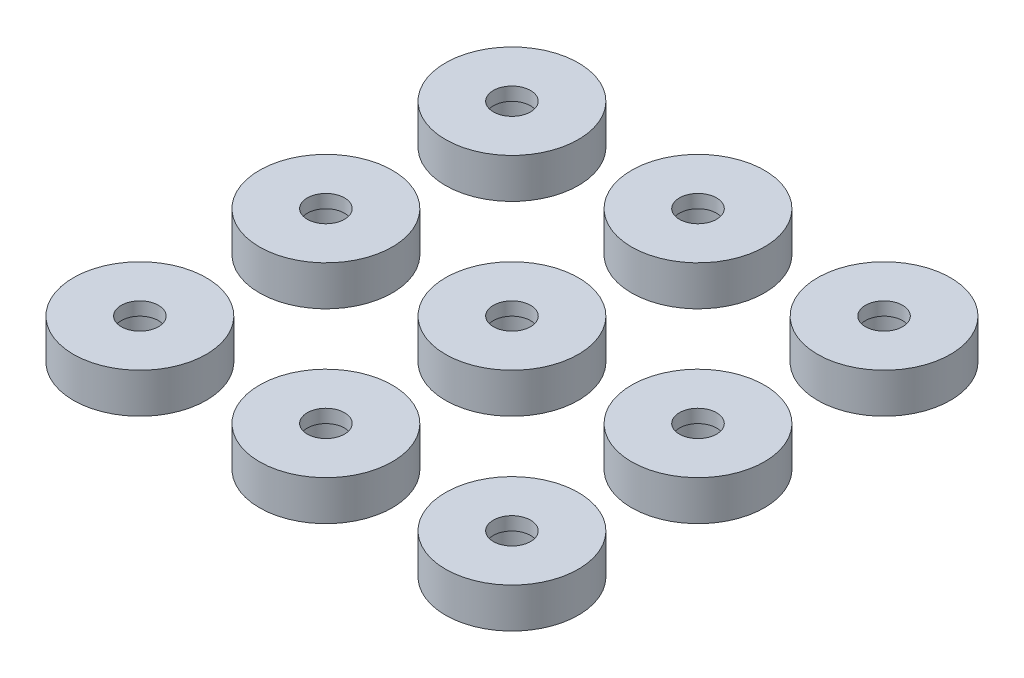
ISO-10303-21;
HEADER;
FILE_DESCRIPTION(('STEP AP214'),'2;1');
FILE_NAME('part.step','',(''),(''),'','','');
FILE_SCHEMA(('AUTOMOTIVE_DESIGN { 1 0 10303 214 1 1 1 1 }'));
ENDSEC;
DATA;
#1=APPLICATION_CONTEXT('core data for automotive mechanical design processes');
#2=APPLICATION_PROTOCOL_DEFINITION('international standard','automotive_design',2000,#1);
#3=PRODUCT_CONTEXT('',#1,'mechanical');
#4=PRODUCT('Part','Part','',(#3));
#5=PRODUCT_RELATED_PRODUCT_CATEGORY('part','',(#4));
#6=PRODUCT_DEFINITION_FORMATION('','',#4);
#7=PRODUCT_DEFINITION_CONTEXT('part definition',#1,'design');
#8=PRODUCT_DEFINITION('design','',#6,#7);
#9=PRODUCT_DEFINITION_SHAPE('','',#8);
#10=(LENGTH_UNIT() NAMED_UNIT(*) SI_UNIT(.MILLI.,.METRE.));
#11=(NAMED_UNIT(*) PLANE_ANGLE_UNIT() SI_UNIT($,.RADIAN.));
#12=(NAMED_UNIT(*) SI_UNIT($,.STERADIAN.) SOLID_ANGLE_UNIT());
#13=UNCERTAINTY_MEASURE_WITH_UNIT(LENGTH_MEASURE(1.E-05),#10,'distance_accuracy_value','');
#14=(GEOMETRIC_REPRESENTATION_CONTEXT(3) GLOBAL_UNCERTAINTY_ASSIGNED_CONTEXT((#13)) GLOBAL_UNIT_ASSIGNED_CONTEXT((#10,
#11,#12)) REPRESENTATION_CONTEXT('',''));
#15=CARTESIAN_POINT('',(0.,0.,0.));
#16=DIRECTION('',(0.,0.,1.));
#17=DIRECTION('',(1.,0.,0.));
#18=AXIS2_PLACEMENT_3D('',#15,#16,#17);
#19=CARTESIAN_POINT('',(14.,1.5,14.));
#20=DIRECTION('',(0.,-1.,0.));
#21=DIRECTION('',(0.,0.,-1.));
#22=AXIS2_PLACEMENT_3D('',#19,#20,#21);
#23=CYLINDRICAL_SURFACE('',#22,2.5);
#24=CARTESIAN_POINT('',(14.,1.5,14.));
#25=DIRECTION('',(0.,1.,0.));
#26=DIRECTION('',(0.,0.,1.));
#27=AXIS2_PLACEMENT_3D('',#24,#25,#26);
#28=CIRCLE('',#27,2.5);
#29=CARTESIAN_POINT('',(14.,1.5,16.5));
#30=VERTEX_POINT('',#29);
#31=EDGE_CURVE('E11',#30,#30,#28,.T.);
#32=ORIENTED_EDGE('',*,*,#31,.F.);
#33=EDGE_LOOP('',(#32));
#34=FACE_BOUND('',#33,.T.);
#35=CARTESIAN_POINT('',(14.,0.,14.));
#36=DIRECTION('',(0.,1.,0.));
#37=DIRECTION('',(0.,0.,1.));
#38=AXIS2_PLACEMENT_3D('',#35,#36,#37);
#39=CIRCLE('',#38,2.5);
#40=CARTESIAN_POINT('',(14.,0.,16.5));
#41=VERTEX_POINT('',#40);
#42=EDGE_CURVE('E53',#41,#41,#39,.T.);
#43=ORIENTED_EDGE('',*,*,#42,.T.);
#44=EDGE_LOOP('',(#43));
#45=FACE_BOUND('',#44,.T.);
#46=ADVANCED_FACE('F46',(#34,#45),#23,.T.);
#47=CARTESIAN_POINT('',(14.,1.5,14.));
#48=DIRECTION('',(0.,1.,0.));
#49=DIRECTION('',(0.,0.,1.));
#50=AXIS2_PLACEMENT_3D('',#47,#48,#49);
#51=PLANE('',#50);
#52=CARTESIAN_POINT('',(14.,1.5,14.));
#53=DIRECTION('',(0.,1.,0.));
#54=DIRECTION('',(0.,0.,1.));
#55=AXIS2_PLACEMENT_3D('',#52,#53,#54);
#56=CIRCLE('',#55,0.7);
#57=CARTESIAN_POINT('',(14.,1.5,14.7));
#58=VERTEX_POINT('',#57);
#59=EDGE_CURVE('E65',#58,#58,#56,.T.);
#60=ORIENTED_EDGE('',*,*,#59,.F.);
#61=EDGE_LOOP('',(#60));
#62=FACE_BOUND('',#61,.T.);
#63=ORIENTED_EDGE('',*,*,#31,.T.);
#64=EDGE_LOOP('',(#63));
#65=FACE_BOUND('',#64,.T.);
#66=ADVANCED_FACE('F89',(#62,#65),#51,.T.);
#67=CARTESIAN_POINT('',(14.,0.,14.));
#68=DIRECTION('',(0.,1.,0.));
#69=DIRECTION('',(0.,0.,1.));
#70=AXIS2_PLACEMENT_3D('',#67,#68,#69);
#71=PLANE('',#70);
#72=CARTESIAN_POINT('',(14.,0.,14.));
#73=DIRECTION('',(0.,1.,0.));
#74=DIRECTION('',(0.,0.,1.));
#75=AXIS2_PLACEMENT_3D('',#72,#73,#74);
#76=CIRCLE('',#75,1.);
#77=CARTESIAN_POINT('',(14.,0.,15.));
#78=VERTEX_POINT('',#77);
#79=EDGE_CURVE('E60',#78,#78,#76,.T.);
#80=ORIENTED_EDGE('',*,*,#79,.T.);
#81=EDGE_LOOP('',(#80));
#82=FACE_BOUND('',#81,.T.);
#83=ORIENTED_EDGE('',*,*,#42,.F.);
#84=EDGE_LOOP('',(#83));
#85=FACE_BOUND('',#84,.T.);
#86=ADVANCED_FACE('F83',(#82,#85),#71,.F.);
#87=CARTESIAN_POINT('',(14.,1.,14.));
#88=DIRECTION('',(0.,-1.,0.));
#89=DIRECTION('',(0.,0.,-1.));
#90=AXIS2_PLACEMENT_3D('',#87,#88,#89);
#91=CYLINDRICAL_SURFACE('',#90,1.);
#92=CARTESIAN_POINT('',(14.,1.,14.));
#93=DIRECTION('',(0.,1.,0.));
#94=DIRECTION('',(0.,0.,1.));
#95=AXIS2_PLACEMENT_3D('',#92,#93,#94);
#96=CIRCLE('',#95,1.);
#97=CARTESIAN_POINT('',(14.,1.,15.));
#98=VERTEX_POINT('',#97);
#99=EDGE_CURVE('E58',#98,#98,#96,.T.);
#100=ORIENTED_EDGE('',*,*,#99,.T.);
#101=EDGE_LOOP('',(#100));
#102=FACE_BOUND('',#101,.T.);
#103=ORIENTED_EDGE('',*,*,#79,.F.);
#104=EDGE_LOOP('',(#103));
#105=FACE_BOUND('',#104,.T.);
#106=ADVANCED_FACE('F77',(#102,#105),#91,.F.);
#107=CARTESIAN_POINT('',(14.,1.,14.));
#108=DIRECTION('',(0.,1.,0.));
#109=DIRECTION('',(0.,0.,1.));
#110=AXIS2_PLACEMENT_3D('',#107,#108,#109);
#111=PLANE('',#110);
#112=CARTESIAN_POINT('',(14.,1.,14.));
#113=DIRECTION('',(0.,1.,0.));
#114=DIRECTION('',(0.,0.,1.));
#115=AXIS2_PLACEMENT_3D('',#112,#113,#114);
#116=CIRCLE('',#115,0.7);
#117=CARTESIAN_POINT('',(14.,1.,14.7));
#118=VERTEX_POINT('',#117);
#119=EDGE_CURVE('E49',#118,#118,#116,.F.);
#120=ORIENTED_EDGE('',*,*,#119,.F.);
#121=EDGE_LOOP('',(#120));
#122=FACE_BOUND('',#121,.T.);
#123=ORIENTED_EDGE('',*,*,#99,.F.);
#124=EDGE_LOOP('',(#123));
#125=FACE_BOUND('',#124,.T.);
#126=ADVANCED_FACE('F74',(#122,#125),#111,.F.);
#127=CARTESIAN_POINT('',(14.,1.5,14.));
#128=DIRECTION('',(0.,-1.,0.));
#129=DIRECTION('',(0.,0.,-1.));
#130=AXIS2_PLACEMENT_3D('',#127,#128,#129);
#131=CYLINDRICAL_SURFACE('',#130,0.7);
#132=ORIENTED_EDGE('',*,*,#59,.T.);
#133=EDGE_LOOP('',(#132));
#134=FACE_BOUND('',#133,.T.);
#135=ORIENTED_EDGE('',*,*,#119,.T.);
#136=EDGE_LOOP('',(#135));
#137=FACE_BOUND('',#136,.T.);
#138=ADVANCED_FACE('F72',(#134,#137),#131,.F.);
#139=CLOSED_SHELL('',(#46,#66,#86,#106,#126,#138));
#140=MANIFOLD_SOLID_BREP('B2',#139);
#141=CARTESIAN_POINT('',(7.,1.5,14.));
#142=DIRECTION('',(0.,-1.,0.));
#143=DIRECTION('',(0.,0.,-1.));
#144=AXIS2_PLACEMENT_3D('',#141,#142,#143);
#145=CYLINDRICAL_SURFACE('',#144,2.5);
#146=CARTESIAN_POINT('',(7.,1.5,14.));
#147=DIRECTION('',(0.,1.,0.));
#148=DIRECTION('',(0.,0.,1.));
#149=AXIS2_PLACEMENT_3D('',#146,#147,#148);
#150=CIRCLE('',#149,2.5);
#151=CARTESIAN_POINT('',(7.,1.5,16.5));
#152=VERTEX_POINT('',#151);
#153=EDGE_CURVE('E45',#152,#152,#150,.T.);
#154=ORIENTED_EDGE('',*,*,#153,.F.);
#155=EDGE_LOOP('',(#154));
#156=FACE_BOUND('',#155,.T.);
#157=CARTESIAN_POINT('',(7.,0.,14.));
#158=DIRECTION('',(0.,1.,0.));
#159=DIRECTION('',(0.,0.,1.));
#160=AXIS2_PLACEMENT_3D('',#157,#158,#159);
#161=CIRCLE('',#160,2.5);
#162=CARTESIAN_POINT('',(7.,0.,16.5));
#163=VERTEX_POINT('',#162);
#164=EDGE_CURVE('E153',#163,#163,#161,.T.);
#165=ORIENTED_EDGE('',*,*,#164,.T.);
#166=EDGE_LOOP('',(#165));
#167=FACE_BOUND('',#166,.T.);
#168=ADVANCED_FACE('F146',(#156,#167),#145,.T.);
#169=CARTESIAN_POINT('',(7.,1.5,14.));
#170=DIRECTION('',(0.,1.,0.));
#171=DIRECTION('',(0.,0.,1.));
#172=AXIS2_PLACEMENT_3D('',#169,#170,#171);
#173=PLANE('',#172);
#174=CARTESIAN_POINT('',(7.,1.5,14.));
#175=DIRECTION('',(0.,1.,0.));
#176=DIRECTION('',(0.,0.,1.));
#177=AXIS2_PLACEMENT_3D('',#174,#175,#176);
#178=CIRCLE('',#177,0.7);
#179=CARTESIAN_POINT('',(7.,1.5,14.7));
#180=VERTEX_POINT('',#179);
#181=EDGE_CURVE('E165',#180,#180,#178,.T.);
#182=ORIENTED_EDGE('',*,*,#181,.F.);
#183=EDGE_LOOP('',(#182));
#184=FACE_BOUND('',#183,.T.);
#185=ORIENTED_EDGE('',*,*,#153,.T.);
#186=EDGE_LOOP('',(#185));
#187=FACE_BOUND('',#186,.T.);
#188=ADVANCED_FACE('F189',(#184,#187),#173,.T.);
#189=CARTESIAN_POINT('',(7.,0.,14.));
#190=DIRECTION('',(0.,1.,0.));
#191=DIRECTION('',(0.,0.,1.));
#192=AXIS2_PLACEMENT_3D('',#189,#190,#191);
#193=PLANE('',#192);
#194=CARTESIAN_POINT('',(7.,0.,14.));
#195=DIRECTION('',(0.,1.,0.));
#196=DIRECTION('',(0.,0.,1.));
#197=AXIS2_PLACEMENT_3D('',#194,#195,#196);
#198=CIRCLE('',#197,1.);
#199=CARTESIAN_POINT('',(7.,0.,15.));
#200=VERTEX_POINT('',#199);
#201=EDGE_CURVE('E160',#200,#200,#198,.T.);
#202=ORIENTED_EDGE('',*,*,#201,.T.);
#203=EDGE_LOOP('',(#202));
#204=FACE_BOUND('',#203,.T.);
#205=ORIENTED_EDGE('',*,*,#164,.F.);
#206=EDGE_LOOP('',(#205));
#207=FACE_BOUND('',#206,.T.);
#208=ADVANCED_FACE('F183',(#204,#207),#193,.F.);
#209=CARTESIAN_POINT('',(7.,1.,14.));
#210=DIRECTION('',(0.,-1.,0.));
#211=DIRECTION('',(0.,0.,-1.));
#212=AXIS2_PLACEMENT_3D('',#209,#210,#211);
#213=CYLINDRICAL_SURFACE('',#212,1.);
#214=CARTESIAN_POINT('',(7.,1.,14.));
#215=DIRECTION('',(0.,1.,0.));
#216=DIRECTION('',(0.,0.,1.));
#217=AXIS2_PLACEMENT_3D('',#214,#215,#216);
#218=CIRCLE('',#217,1.);
#219=CARTESIAN_POINT('',(7.,1.,15.));
#220=VERTEX_POINT('',#219);
#221=EDGE_CURVE('E158',#220,#220,#218,.T.);
#222=ORIENTED_EDGE('',*,*,#221,.T.);
#223=EDGE_LOOP('',(#222));
#224=FACE_BOUND('',#223,.T.);
#225=ORIENTED_EDGE('',*,*,#201,.F.);
#226=EDGE_LOOP('',(#225));
#227=FACE_BOUND('',#226,.T.);
#228=ADVANCED_FACE('F177',(#224,#227),#213,.F.);
#229=CARTESIAN_POINT('',(7.,1.,14.));
#230=DIRECTION('',(0.,1.,0.));
#231=DIRECTION('',(0.,0.,1.));
#232=AXIS2_PLACEMENT_3D('',#229,#230,#231);
#233=PLANE('',#232);
#234=CARTESIAN_POINT('',(7.,1.,14.));
#235=DIRECTION('',(0.,1.,0.));
#236=DIRECTION('',(0.,0.,1.));
#237=AXIS2_PLACEMENT_3D('',#234,#235,#236);
#238=CIRCLE('',#237,0.7);
#239=CARTESIAN_POINT('',(7.,1.,14.7));
#240=VERTEX_POINT('',#239);
#241=EDGE_CURVE('E149',#240,#240,#238,.F.);
#242=ORIENTED_EDGE('',*,*,#241,.F.);
#243=EDGE_LOOP('',(#242));
#244=FACE_BOUND('',#243,.T.);
#245=ORIENTED_EDGE('',*,*,#221,.F.);
#246=EDGE_LOOP('',(#245));
#247=FACE_BOUND('',#246,.T.);
#248=ADVANCED_FACE('F174',(#244,#247),#233,.F.);
#249=CARTESIAN_POINT('',(7.,1.5,14.));
#250=DIRECTION('',(0.,-1.,0.));
#251=DIRECTION('',(0.,0.,-1.));
#252=AXIS2_PLACEMENT_3D('',#249,#250,#251);
#253=CYLINDRICAL_SURFACE('',#252,0.7);
#254=ORIENTED_EDGE('',*,*,#181,.T.);
#255=EDGE_LOOP('',(#254));
#256=FACE_BOUND('',#255,.T.);
#257=ORIENTED_EDGE('',*,*,#241,.T.);
#258=EDGE_LOOP('',(#257));
#259=FACE_BOUND('',#258,.T.);
#260=ADVANCED_FACE('F172',(#256,#259),#253,.F.);
#261=CLOSED_SHELL('',(#168,#188,#208,#228,#248,#260));
#262=MANIFOLD_SOLID_BREP('B6',#261);
#263=CARTESIAN_POINT('',(14.,1.5,7.));
#264=DIRECTION('',(0.,-1.,0.));
#265=DIRECTION('',(0.,0.,-1.));
#266=AXIS2_PLACEMENT_3D('',#263,#264,#265);
#267=CYLINDRICAL_SURFACE('',#266,2.5);
#268=CARTESIAN_POINT('',(14.,1.5,7.));
#269=DIRECTION('',(0.,1.,0.));
#270=DIRECTION('',(0.,0.,1.));
#271=AXIS2_PLACEMENT_3D('',#268,#269,#270);
#272=CIRCLE('',#271,2.5);
#273=CARTESIAN_POINT('',(14.,1.5,9.5));
#274=VERTEX_POINT('',#273);
#275=EDGE_CURVE('E145',#274,#274,#272,.T.);
#276=ORIENTED_EDGE('',*,*,#275,.F.);
#277=EDGE_LOOP('',(#276));
#278=FACE_BOUND('',#277,.T.);
#279=CARTESIAN_POINT('',(14.,0.,7.));
#280=DIRECTION('',(0.,1.,0.));
#281=DIRECTION('',(0.,0.,1.));
#282=AXIS2_PLACEMENT_3D('',#279,#280,#281);
#283=CIRCLE('',#282,2.5);
#284=CARTESIAN_POINT('',(14.,0.,9.5));
#285=VERTEX_POINT('',#284);
#286=EDGE_CURVE('E253',#285,#285,#283,.T.);
#287=ORIENTED_EDGE('',*,*,#286,.T.);
#288=EDGE_LOOP('',(#287));
#289=FACE_BOUND('',#288,.T.);
#290=ADVANCED_FACE('F246',(#278,#289),#267,.T.);
#291=CARTESIAN_POINT('',(14.,1.5,7.));
#292=DIRECTION('',(0.,1.,0.));
#293=DIRECTION('',(0.,0.,1.));
#294=AXIS2_PLACEMENT_3D('',#291,#292,#293);
#295=PLANE('',#294);
#296=CARTESIAN_POINT('',(14.,1.5,7.));
#297=DIRECTION('',(0.,1.,0.));
#298=DIRECTION('',(0.,0.,1.));
#299=AXIS2_PLACEMENT_3D('',#296,#297,#298);
#300=CIRCLE('',#299,0.7);
#301=CARTESIAN_POINT('',(14.,1.5,7.7));
#302=VERTEX_POINT('',#301);
#303=EDGE_CURVE('E265',#302,#302,#300,.T.);
#304=ORIENTED_EDGE('',*,*,#303,.F.);
#305=EDGE_LOOP('',(#304));
#306=FACE_BOUND('',#305,.T.);
#307=ORIENTED_EDGE('',*,*,#275,.T.);
#308=EDGE_LOOP('',(#307));
#309=FACE_BOUND('',#308,.T.);
#310=ADVANCED_FACE('F289',(#306,#309),#295,.T.);
#311=CARTESIAN_POINT('',(14.,0.,7.));
#312=DIRECTION('',(0.,1.,0.));
#313=DIRECTION('',(0.,0.,1.));
#314=AXIS2_PLACEMENT_3D('',#311,#312,#313);
#315=PLANE('',#314);
#316=CARTESIAN_POINT('',(14.,0.,7.));
#317=DIRECTION('',(0.,1.,0.));
#318=DIRECTION('',(0.,0.,1.));
#319=AXIS2_PLACEMENT_3D('',#316,#317,#318);
#320=CIRCLE('',#319,1.);
#321=CARTESIAN_POINT('',(14.,0.,8.));
#322=VERTEX_POINT('',#321);
#323=EDGE_CURVE('E260',#322,#322,#320,.T.);
#324=ORIENTED_EDGE('',*,*,#323,.T.);
#325=EDGE_LOOP('',(#324));
#326=FACE_BOUND('',#325,.T.);
#327=ORIENTED_EDGE('',*,*,#286,.F.);
#328=EDGE_LOOP('',(#327));
#329=FACE_BOUND('',#328,.T.);
#330=ADVANCED_FACE('F283',(#326,#329),#315,.F.);
#331=CARTESIAN_POINT('',(14.,1.,7.));
#332=DIRECTION('',(0.,-1.,0.));
#333=DIRECTION('',(0.,0.,-1.));
#334=AXIS2_PLACEMENT_3D('',#331,#332,#333);
#335=CYLINDRICAL_SURFACE('',#334,1.);
#336=CARTESIAN_POINT('',(14.,1.,7.));
#337=DIRECTION('',(0.,1.,0.));
#338=DIRECTION('',(0.,0.,1.));
#339=AXIS2_PLACEMENT_3D('',#336,#337,#338);
#340=CIRCLE('',#339,1.);
#341=CARTESIAN_POINT('',(14.,1.,8.));
#342=VERTEX_POINT('',#341);
#343=EDGE_CURVE('E258',#342,#342,#340,.T.);
#344=ORIENTED_EDGE('',*,*,#343,.T.);
#345=EDGE_LOOP('',(#344));
#346=FACE_BOUND('',#345,.T.);
#347=ORIENTED_EDGE('',*,*,#323,.F.);
#348=EDGE_LOOP('',(#347));
#349=FACE_BOUND('',#348,.T.);
#350=ADVANCED_FACE('F277',(#346,#349),#335,.F.);
#351=CARTESIAN_POINT('',(14.,1.,7.));
#352=DIRECTION('',(0.,1.,0.));
#353=DIRECTION('',(0.,0.,1.));
#354=AXIS2_PLACEMENT_3D('',#351,#352,#353);
#355=PLANE('',#354);
#356=CARTESIAN_POINT('',(14.,1.,7.));
#357=DIRECTION('',(0.,1.,0.));
#358=DIRECTION('',(0.,0.,1.));
#359=AXIS2_PLACEMENT_3D('',#356,#357,#358);
#360=CIRCLE('',#359,0.7);
#361=CARTESIAN_POINT('',(14.,1.,7.7));
#362=VERTEX_POINT('',#361);
#363=EDGE_CURVE('E249',#362,#362,#360,.F.);
#364=ORIENTED_EDGE('',*,*,#363,.F.);
#365=EDGE_LOOP('',(#364));
#366=FACE_BOUND('',#365,.T.);
#367=ORIENTED_EDGE('',*,*,#343,.F.);
#368=EDGE_LOOP('',(#367));
#369=FACE_BOUND('',#368,.T.);
#370=ADVANCED_FACE('F274',(#366,#369),#355,.F.);
#371=CARTESIAN_POINT('',(14.,1.5,7.));
#372=DIRECTION('',(0.,-1.,0.));
#373=DIRECTION('',(0.,0.,-1.));
#374=AXIS2_PLACEMENT_3D('',#371,#372,#373);
#375=CYLINDRICAL_SURFACE('',#374,0.7);
#376=ORIENTED_EDGE('',*,*,#303,.T.);
#377=EDGE_LOOP('',(#376));
#378=FACE_BOUND('',#377,.T.);
#379=ORIENTED_EDGE('',*,*,#363,.T.);
#380=EDGE_LOOP('',(#379));
#381=FACE_BOUND('',#380,.T.);
#382=ADVANCED_FACE('F272',(#378,#381),#375,.F.);
#383=CLOSED_SHELL('',(#290,#310,#330,#350,#370,#382));
#384=MANIFOLD_SOLID_BREP('B40',#383);
#385=CARTESIAN_POINT('',(7.,1.5,7.));
#386=DIRECTION('',(0.,-1.,0.));
#387=DIRECTION('',(0.,0.,-1.));
#388=AXIS2_PLACEMENT_3D('',#385,#386,#387);
#389=CYLINDRICAL_SURFACE('',#388,2.5);
#390=CARTESIAN_POINT('',(7.,1.5,7.));
#391=DIRECTION('',(0.,1.,0.));
#392=DIRECTION('',(0.,0.,1.));
#393=AXIS2_PLACEMENT_3D('',#390,#391,#392);
#394=CIRCLE('',#393,2.5);
#395=CARTESIAN_POINT('',(7.,1.5,9.5));
#396=VERTEX_POINT('',#395);
#397=EDGE_CURVE('E245',#396,#396,#394,.T.);
#398=ORIENTED_EDGE('',*,*,#397,.F.);
#399=EDGE_LOOP('',(#398));
#400=FACE_BOUND('',#399,.T.);
#401=CARTESIAN_POINT('',(7.,0.,7.));
#402=DIRECTION('',(0.,1.,0.));
#403=DIRECTION('',(0.,0.,1.));
#404=AXIS2_PLACEMENT_3D('',#401,#402,#403);
#405=CIRCLE('',#404,2.5);
#406=CARTESIAN_POINT('',(7.,0.,9.5));
#407=VERTEX_POINT('',#406);
#408=EDGE_CURVE('E353',#407,#407,#405,.T.);
#409=ORIENTED_EDGE('',*,*,#408,.T.);
#410=EDGE_LOOP('',(#409));
#411=FACE_BOUND('',#410,.T.);
#412=ADVANCED_FACE('F346',(#400,#411),#389,.T.);
#413=CARTESIAN_POINT('',(7.,1.5,7.));
#414=DIRECTION('',(0.,1.,0.));
#415=DIRECTION('',(0.,0.,1.));
#416=AXIS2_PLACEMENT_3D('',#413,#414,#415);
#417=PLANE('',#416);
#418=CARTESIAN_POINT('',(7.,1.5,7.));
#419=DIRECTION('',(0.,1.,0.));
#420=DIRECTION('',(0.,0.,1.));
#421=AXIS2_PLACEMENT_3D('',#418,#419,#420);
#422=CIRCLE('',#421,0.7);
#423=CARTESIAN_POINT('',(7.,1.5,7.7));
#424=VERTEX_POINT('',#423);
#425=EDGE_CURVE('E365',#424,#424,#422,.T.);
#426=ORIENTED_EDGE('',*,*,#425,.F.);
#427=EDGE_LOOP('',(#426));
#428=FACE_BOUND('',#427,.T.);
#429=ORIENTED_EDGE('',*,*,#397,.T.);
#430=EDGE_LOOP('',(#429));
#431=FACE_BOUND('',#430,.T.);
#432=ADVANCED_FACE('F389',(#428,#431),#417,.T.);
#433=CARTESIAN_POINT('',(7.,0.,7.));
#434=DIRECTION('',(0.,1.,0.));
#435=DIRECTION('',(0.,0.,1.));
#436=AXIS2_PLACEMENT_3D('',#433,#434,#435);
#437=PLANE('',#436);
#438=CARTESIAN_POINT('',(7.,0.,7.));
#439=DIRECTION('',(0.,1.,0.));
#440=DIRECTION('',(0.,0.,1.));
#441=AXIS2_PLACEMENT_3D('',#438,#439,#440);
#442=CIRCLE('',#441,1.);
#443=CARTESIAN_POINT('',(7.,0.,8.));
#444=VERTEX_POINT('',#443);
#445=EDGE_CURVE('E360',#444,#444,#442,.T.);
#446=ORIENTED_EDGE('',*,*,#445,.T.);
#447=EDGE_LOOP('',(#446));
#448=FACE_BOUND('',#447,.T.);
#449=ORIENTED_EDGE('',*,*,#408,.F.);
#450=EDGE_LOOP('',(#449));
#451=FACE_BOUND('',#450,.T.);
#452=ADVANCED_FACE('F383',(#448,#451),#437,.F.);
#453=CARTESIAN_POINT('',(7.,1.,7.));
#454=DIRECTION('',(0.,-1.,0.));
#455=DIRECTION('',(0.,0.,-1.));
#456=AXIS2_PLACEMENT_3D('',#453,#454,#455);
#457=CYLINDRICAL_SURFACE('',#456,1.);
#458=CARTESIAN_POINT('',(7.,1.,7.));
#459=DIRECTION('',(0.,1.,0.));
#460=DIRECTION('',(0.,0.,1.));
#461=AXIS2_PLACEMENT_3D('',#458,#459,#460);
#462=CIRCLE('',#461,1.);
#463=CARTESIAN_POINT('',(7.,1.,8.));
#464=VERTEX_POINT('',#463);
#465=EDGE_CURVE('E358',#464,#464,#462,.T.);
#466=ORIENTED_EDGE('',*,*,#465,.T.);
#467=EDGE_LOOP('',(#466));
#468=FACE_BOUND('',#467,.T.);
#469=ORIENTED_EDGE('',*,*,#445,.F.);
#470=EDGE_LOOP('',(#469));
#471=FACE_BOUND('',#470,.T.);
#472=ADVANCED_FACE('F377',(#468,#471),#457,.F.);
#473=CARTESIAN_POINT('',(7.,1.,7.));
#474=DIRECTION('',(0.,1.,0.));
#475=DIRECTION('',(0.,0.,1.));
#476=AXIS2_PLACEMENT_3D('',#473,#474,#475);
#477=PLANE('',#476);
#478=CARTESIAN_POINT('',(7.,1.,7.));
#479=DIRECTION('',(0.,1.,0.));
#480=DIRECTION('',(0.,0.,1.));
#481=AXIS2_PLACEMENT_3D('',#478,#479,#480);
#482=CIRCLE('',#481,0.7);
#483=CARTESIAN_POINT('',(7.,1.,7.7));
#484=VERTEX_POINT('',#483);
#485=EDGE_CURVE('E349',#484,#484,#482,.F.);
#486=ORIENTED_EDGE('',*,*,#485,.F.);
#487=EDGE_LOOP('',(#486));
#488=FACE_BOUND('',#487,.T.);
#489=ORIENTED_EDGE('',*,*,#465,.F.);
#490=EDGE_LOOP('',(#489));
#491=FACE_BOUND('',#490,.T.);
#492=ADVANCED_FACE('F374',(#488,#491),#477,.F.);
#493=CARTESIAN_POINT('',(7.,1.5,7.));
#494=DIRECTION('',(0.,-1.,0.));
#495=DIRECTION('',(0.,0.,-1.));
#496=AXIS2_PLACEMENT_3D('',#493,#494,#495);
#497=CYLINDRICAL_SURFACE('',#496,0.7);
#498=ORIENTED_EDGE('',*,*,#425,.T.);
#499=EDGE_LOOP('',(#498));
#500=FACE_BOUND('',#499,.T.);
#501=ORIENTED_EDGE('',*,*,#485,.T.);
#502=EDGE_LOOP('',(#501));
#503=FACE_BOUND('',#502,.T.);
#504=ADVANCED_FACE('F372',(#500,#503),#497,.F.);
#505=CLOSED_SHELL('',(#412,#432,#452,#472,#492,#504));
#506=MANIFOLD_SOLID_BREP('B140',#505);
#507=CARTESIAN_POINT('',(14.,1.5,0.));
#508=DIRECTION('',(0.,-1.,0.));
#509=DIRECTION('',(0.,0.,-1.));
#510=AXIS2_PLACEMENT_3D('',#507,#508,#509);
#511=CYLINDRICAL_SURFACE('',#510,2.5);
#512=CARTESIAN_POINT('',(14.,1.5,0.));
#513=DIRECTION('',(0.,1.,0.));
#514=DIRECTION('',(0.,0.,1.));
#515=AXIS2_PLACEMENT_3D('',#512,#513,#514);
#516=CIRCLE('',#515,2.5);
#517=CARTESIAN_POINT('',(14.,1.5,2.5));
#518=VERTEX_POINT('',#517);
#519=EDGE_CURVE('E345',#518,#518,#516,.T.);
#520=ORIENTED_EDGE('',*,*,#519,.F.);
#521=EDGE_LOOP('',(#520));
#522=FACE_BOUND('',#521,.T.);
#523=CARTESIAN_POINT('',(14.,0.,0.));
#524=DIRECTION('',(0.,1.,0.));
#525=DIRECTION('',(0.,0.,1.));
#526=AXIS2_PLACEMENT_3D('',#523,#524,#525);
#527=CIRCLE('',#526,2.5);
#528=CARTESIAN_POINT('',(14.,0.,2.5));
#529=VERTEX_POINT('',#528);
#530=EDGE_CURVE('E453',#529,#529,#527,.T.);
#531=ORIENTED_EDGE('',*,*,#530,.T.);
#532=EDGE_LOOP('',(#531));
#533=FACE_BOUND('',#532,.T.);
#534=ADVANCED_FACE('F446',(#522,#533),#511,.T.);
#535=CARTESIAN_POINT('',(14.,1.5,0.));
#536=DIRECTION('',(0.,1.,0.));
#537=DIRECTION('',(0.,0.,1.));
#538=AXIS2_PLACEMENT_3D('',#535,#536,#537);
#539=PLANE('',#538);
#540=CARTESIAN_POINT('',(14.,1.5,0.));
#541=DIRECTION('',(0.,1.,0.));
#542=DIRECTION('',(0.,0.,1.));
#543=AXIS2_PLACEMENT_3D('',#540,#541,#542);
#544=CIRCLE('',#543,0.7);
#545=CARTESIAN_POINT('',(14.,1.5,0.7));
#546=VERTEX_POINT('',#545);
#547=EDGE_CURVE('E465',#546,#546,#544,.T.);
#548=ORIENTED_EDGE('',*,*,#547,.F.);
#549=EDGE_LOOP('',(#548));
#550=FACE_BOUND('',#549,.T.);
#551=ORIENTED_EDGE('',*,*,#519,.T.);
#552=EDGE_LOOP('',(#551));
#553=FACE_BOUND('',#552,.T.);
#554=ADVANCED_FACE('F489',(#550,#553),#539,.T.);
#555=CARTESIAN_POINT('',(14.,0.,0.));
#556=DIRECTION('',(0.,1.,0.));
#557=DIRECTION('',(0.,0.,1.));
#558=AXIS2_PLACEMENT_3D('',#555,#556,#557);
#559=PLANE('',#558);
#560=CARTESIAN_POINT('',(14.,0.,0.));
#561=DIRECTION('',(0.,1.,0.));
#562=DIRECTION('',(0.,0.,1.));
#563=AXIS2_PLACEMENT_3D('',#560,#561,#562);
#564=CIRCLE('',#563,1.);
#565=CARTESIAN_POINT('',(14.,0.,1.));
#566=VERTEX_POINT('',#565);
#567=EDGE_CURVE('E460',#566,#566,#564,.T.);
#568=ORIENTED_EDGE('',*,*,#567,.T.);
#569=EDGE_LOOP('',(#568));
#570=FACE_BOUND('',#569,.T.);
#571=ORIENTED_EDGE('',*,*,#530,.F.);
#572=EDGE_LOOP('',(#571));
#573=FACE_BOUND('',#572,.T.);
#574=ADVANCED_FACE('F483',(#570,#573),#559,.F.);
#575=CARTESIAN_POINT('',(14.,1.,0.));
#576=DIRECTION('',(0.,-1.,0.));
#577=DIRECTION('',(0.,0.,-1.));
#578=AXIS2_PLACEMENT_3D('',#575,#576,#577);
#579=CYLINDRICAL_SURFACE('',#578,1.);
#580=CARTESIAN_POINT('',(14.,1.,0.));
#581=DIRECTION('',(0.,1.,0.));
#582=DIRECTION('',(0.,0.,1.));
#583=AXIS2_PLACEMENT_3D('',#580,#581,#582);
#584=CIRCLE('',#583,1.);
#585=CARTESIAN_POINT('',(14.,1.,1.));
#586=VERTEX_POINT('',#585);
#587=EDGE_CURVE('E458',#586,#586,#584,.T.);
#588=ORIENTED_EDGE('',*,*,#587,.T.);
#589=EDGE_LOOP('',(#588));
#590=FACE_BOUND('',#589,.T.);
#591=ORIENTED_EDGE('',*,*,#567,.F.);
#592=EDGE_LOOP('',(#591));
#593=FACE_BOUND('',#592,.T.);
#594=ADVANCED_FACE('F477',(#590,#593),#579,.F.);
#595=CARTESIAN_POINT('',(14.,1.,0.));
#596=DIRECTION('',(0.,1.,0.));
#597=DIRECTION('',(0.,0.,1.));
#598=AXIS2_PLACEMENT_3D('',#595,#596,#597);
#599=PLANE('',#598);
#600=CARTESIAN_POINT('',(14.,1.,0.));
#601=DIRECTION('',(0.,1.,0.));
#602=DIRECTION('',(0.,0.,1.));
#603=AXIS2_PLACEMENT_3D('',#600,#601,#602);
#604=CIRCLE('',#603,0.7);
#605=CARTESIAN_POINT('',(14.,1.,0.7));
#606=VERTEX_POINT('',#605);
#607=EDGE_CURVE('E449',#606,#606,#604,.F.);
#608=ORIENTED_EDGE('',*,*,#607,.F.);
#609=EDGE_LOOP('',(#608));
#610=FACE_BOUND('',#609,.T.);
#611=ORIENTED_EDGE('',*,*,#587,.F.);
#612=EDGE_LOOP('',(#611));
#613=FACE_BOUND('',#612,.T.);
#614=ADVANCED_FACE('F474',(#610,#613),#599,.F.);
#615=CARTESIAN_POINT('',(14.,1.5,0.));
#616=DIRECTION('',(0.,-1.,0.));
#617=DIRECTION('',(0.,0.,-1.));
#618=AXIS2_PLACEMENT_3D('',#615,#616,#617);
#619=CYLINDRICAL_SURFACE('',#618,0.7);
#620=ORIENTED_EDGE('',*,*,#547,.T.);
#621=EDGE_LOOP('',(#620));
#622=FACE_BOUND('',#621,.T.);
#623=ORIENTED_EDGE('',*,*,#607,.T.);
#624=EDGE_LOOP('',(#623));
#625=FACE_BOUND('',#624,.T.);
#626=ADVANCED_FACE('F472',(#622,#625),#619,.F.);
#627=CLOSED_SHELL('',(#534,#554,#574,#594,#614,#626));
#628=MANIFOLD_SOLID_BREP('B240',#627);
#629=CARTESIAN_POINT('',(7.,1.5,0.));
#630=DIRECTION('',(0.,-1.,0.));
#631=DIRECTION('',(0.,0.,-1.));
#632=AXIS2_PLACEMENT_3D('',#629,#630,#631);
#633=CYLINDRICAL_SURFACE('',#632,2.5);
#634=CARTESIAN_POINT('',(7.,1.5,0.));
#635=DIRECTION('',(0.,1.,0.));
#636=DIRECTION('',(0.,0.,1.));
#637=AXIS2_PLACEMENT_3D('',#634,#635,#636);
#638=CIRCLE('',#637,2.5);
#639=CARTESIAN_POINT('',(7.,1.5,2.5));
#640=VERTEX_POINT('',#639);
#641=EDGE_CURVE('E445',#640,#640,#638,.T.);
#642=ORIENTED_EDGE('',*,*,#641,.F.);
#643=EDGE_LOOP('',(#642));
#644=FACE_BOUND('',#643,.T.);
#645=CARTESIAN_POINT('',(7.,0.,0.));
#646=DIRECTION('',(0.,1.,0.));
#647=DIRECTION('',(0.,0.,1.));
#648=AXIS2_PLACEMENT_3D('',#645,#646,#647);
#649=CIRCLE('',#648,2.5);
#650=CARTESIAN_POINT('',(7.,0.,2.5));
#651=VERTEX_POINT('',#650);
#652=EDGE_CURVE('E554',#651,#651,#649,.T.);
#653=ORIENTED_EDGE('',*,*,#652,.T.);
#654=EDGE_LOOP('',(#653));
#655=FACE_BOUND('',#654,.T.);
#656=ADVANCED_FACE('F546',(#644,#655),#633,.T.);
#657=CARTESIAN_POINT('',(7.,1.5,0.));
#658=DIRECTION('',(0.,1.,0.));
#659=DIRECTION('',(0.,0.,1.));
#660=AXIS2_PLACEMENT_3D('',#657,#658,#659);
#661=PLANE('',#660);
#662=CARTESIAN_POINT('',(7.,1.5,0.));
#663=DIRECTION('',(0.,1.,0.));
#664=DIRECTION('',(0.,0.,1.));
#665=AXIS2_PLACEMENT_3D('',#662,#663,#664);
#666=CIRCLE('',#665,0.7);
#667=CARTESIAN_POINT('',(7.,1.5,0.7));
#668=VERTEX_POINT('',#667);
#669=EDGE_CURVE('E569',#668,#668,#666,.T.);
#670=ORIENTED_EDGE('',*,*,#669,.F.);
#671=EDGE_LOOP('',(#670));
#672=FACE_BOUND('',#671,.T.);
#673=ORIENTED_EDGE('',*,*,#641,.T.);
#674=EDGE_LOOP('',(#673));
#675=FACE_BOUND('',#674,.T.);
#676=ADVANCED_FACE('F595',(#672,#675),#661,.T.);
#677=CARTESIAN_POINT('',(7.,0.,0.));
#678=DIRECTION('',(0.,1.,0.));
#679=DIRECTION('',(0.,0.,1.));
#680=AXIS2_PLACEMENT_3D('',#677,#678,#679);
#681=PLANE('',#680);
#682=CARTESIAN_POINT('',(7.,0.,0.));
#683=DIRECTION('',(0.,1.,0.));
#684=DIRECTION('',(0.,0.,1.));
#685=AXIS2_PLACEMENT_3D('',#682,#683,#684);
#686=CIRCLE('',#685,1.);
#687=CARTESIAN_POINT('',(7.,0.,1.));
#688=VERTEX_POINT('',#687);
#689=EDGE_CURVE('E562',#688,#688,#686,.T.);
#690=ORIENTED_EDGE('',*,*,#689,.T.);
#691=EDGE_LOOP('',(#690));
#692=FACE_BOUND('',#691,.T.);
#693=ORIENTED_EDGE('',*,*,#652,.F.);
#694=EDGE_LOOP('',(#693));
#695=FACE_BOUND('',#694,.T.);
#696=ADVANCED_FACE('F589',(#692,#695),#681,.F.);
#697=CARTESIAN_POINT('',(7.,1.,0.));
#698=DIRECTION('',(0.,-1.,0.));
#699=DIRECTION('',(0.,0.,-1.));
#700=AXIS2_PLACEMENT_3D('',#697,#698,#699);
#701=CYLINDRICAL_SURFACE('',#700,1.);
#702=CARTESIAN_POINT('',(7.,1.,0.));
#703=DIRECTION('',(0.,1.,0.));
#704=DIRECTION('',(0.,0.,1.));
#705=AXIS2_PLACEMENT_3D('',#702,#703,#704);
#706=CIRCLE('',#705,1.);
#707=CARTESIAN_POINT('',(7.,1.,1.));
#708=VERTEX_POINT('',#707);
#709=EDGE_CURVE('E560',#708,#708,#706,.T.);
#710=ORIENTED_EDGE('',*,*,#709,.T.);
#711=EDGE_LOOP('',(#710));
#712=FACE_BOUND('',#711,.T.);
#713=ORIENTED_EDGE('',*,*,#689,.F.);
#714=EDGE_LOOP('',(#713));
#715=FACE_BOUND('',#714,.T.);
#716=ADVANCED_FACE('F583',(#712,#715),#701,.F.);
#717=CARTESIAN_POINT('',(7.,1.,0.));
#718=DIRECTION('',(0.,1.,0.));
#719=DIRECTION('',(0.,0.,1.));
#720=AXIS2_PLACEMENT_3D('',#717,#718,#719);
#721=PLANE('',#720);
#722=CARTESIAN_POINT('',(7.,1.,0.));
#723=DIRECTION('',(0.,1.,0.));
#724=DIRECTION('',(0.,0.,1.));
#725=AXIS2_PLACEMENT_3D('',#722,#723,#724);
#726=CIRCLE('',#725,0.7);
#727=CARTESIAN_POINT('',(7.,1.,0.7));
#728=VERTEX_POINT('',#727);
#729=EDGE_CURVE('E549',#728,#728,#726,.F.);
#730=ORIENTED_EDGE('',*,*,#729,.F.);
#731=EDGE_LOOP('',(#730));
#732=FACE_BOUND('',#731,.T.);
#733=ORIENTED_EDGE('',*,*,#709,.F.);
#734=EDGE_LOOP('',(#733));
#735=FACE_BOUND('',#734,.T.);
#736=ADVANCED_FACE('F580',(#732,#735),#721,.F.);
#737=CARTESIAN_POINT('',(7.,1.5,0.));
#738=DIRECTION('',(0.,-1.,0.));
#739=DIRECTION('',(0.,0.,-1.));
#740=AXIS2_PLACEMENT_3D('',#737,#738,#739);
#741=CYLINDRICAL_SURFACE('',#740,0.7);
#742=ORIENTED_EDGE('',*,*,#669,.T.);
#743=EDGE_LOOP('',(#742));
#744=FACE_BOUND('',#743,.T.);
#745=ORIENTED_EDGE('',*,*,#729,.T.);
#746=EDGE_LOOP('',(#745));
#747=FACE_BOUND('',#746,.T.);
#748=ADVANCED_FACE('F578',(#744,#747),#741,.F.);
#749=CLOSED_SHELL('',(#656,#676,#696,#716,#736,#748));
#750=MANIFOLD_SOLID_BREP('B340',#749);
#751=CARTESIAN_POINT('',(0.,1.5,14.));
#752=DIRECTION('',(0.,-1.,0.));
#753=DIRECTION('',(0.,0.,-1.));
#754=AXIS2_PLACEMENT_3D('',#751,#752,#753);
#755=CYLINDRICAL_SURFACE('',#754,2.5);
#756=CARTESIAN_POINT('',(0.,1.5,14.));
#757=DIRECTION('',(0.,1.,0.));
#758=DIRECTION('',(0.,0.,1.));
#759=AXIS2_PLACEMENT_3D('',#756,#757,#758);
#760=CIRCLE('',#759,2.5);
#761=CARTESIAN_POINT('',(0.,1.5,16.5));
#762=VERTEX_POINT('',#761);
#763=EDGE_CURVE('E545',#762,#762,#760,.T.);
#764=ORIENTED_EDGE('',*,*,#763,.F.);
#765=EDGE_LOOP('',(#764));
#766=FACE_BOUND('',#765,.T.);
#767=CARTESIAN_POINT('',(0.,0.,14.));
#768=DIRECTION('',(0.,1.,0.));
#769=DIRECTION('',(0.,0.,1.));
#770=AXIS2_PLACEMENT_3D('',#767,#768,#769);
#771=CIRCLE('',#770,2.5);
#772=CARTESIAN_POINT('',(0.,0.,16.5));
#773=VERTEX_POINT('',#772);
#774=EDGE_CURVE('E659',#773,#773,#771,.T.);
#775=ORIENTED_EDGE('',*,*,#774,.T.);
#776=EDGE_LOOP('',(#775));
#777=FACE_BOUND('',#776,.T.);
#778=ADVANCED_FACE('F652',(#766,#777),#755,.T.);
#779=CARTESIAN_POINT('',(0.,1.5,14.));
#780=DIRECTION('',(0.,1.,0.));
#781=DIRECTION('',(0.,0.,1.));
#782=AXIS2_PLACEMENT_3D('',#779,#780,#781);
#783=PLANE('',#782);
#784=CARTESIAN_POINT('',(0.,1.5,14.));
#785=DIRECTION('',(0.,1.,0.));
#786=DIRECTION('',(0.,0.,1.));
#787=AXIS2_PLACEMENT_3D('',#784,#785,#786);
#788=CIRCLE('',#787,0.7);
#789=CARTESIAN_POINT('',(0.,1.5,14.7));
#790=VERTEX_POINT('',#789);
#791=EDGE_CURVE('E671',#790,#790,#788,.T.);
#792=ORIENTED_EDGE('',*,*,#791,.F.);
#793=EDGE_LOOP('',(#792));
#794=FACE_BOUND('',#793,.T.);
#795=ORIENTED_EDGE('',*,*,#763,.T.);
#796=EDGE_LOOP('',(#795));
#797=FACE_BOUND('',#796,.T.);
#798=ADVANCED_FACE('F695',(#794,#797),#783,.T.);
#799=CARTESIAN_POINT('',(0.,0.,14.));
#800=DIRECTION('',(0.,1.,0.));
#801=DIRECTION('',(0.,0.,1.));
#802=AXIS2_PLACEMENT_3D('',#799,#800,#801);
#803=PLANE('',#802);
#804=CARTESIAN_POINT('',(0.,0.,14.));
#805=DIRECTION('',(0.,1.,0.));
#806=DIRECTION('',(0.,0.,1.));
#807=AXIS2_PLACEMENT_3D('',#804,#805,#806);
#808=CIRCLE('',#807,1.);
#809=CARTESIAN_POINT('',(0.,0.,15.));
#810=VERTEX_POINT('',#809);
#811=EDGE_CURVE('E666',#810,#810,#808,.T.);
#812=ORIENTED_EDGE('',*,*,#811,.T.);
#813=EDGE_LOOP('',(#812));
#814=FACE_BOUND('',#813,.T.);
#815=ORIENTED_EDGE('',*,*,#774,.F.);
#816=EDGE_LOOP('',(#815));
#817=FACE_BOUND('',#816,.T.);
#818=ADVANCED_FACE('F689',(#814,#817),#803,.F.);
#819=CARTESIAN_POINT('',(0.,1.,14.));
#820=DIRECTION('',(0.,-1.,0.));
#821=DIRECTION('',(0.,0.,-1.));
#822=AXIS2_PLACEMENT_3D('',#819,#820,#821);
#823=CYLINDRICAL_SURFACE('',#822,1.);
#824=CARTESIAN_POINT('',(0.,1.,14.));
#825=DIRECTION('',(0.,1.,0.));
#826=DIRECTION('',(0.,0.,1.));
#827=AXIS2_PLACEMENT_3D('',#824,#825,#826);
#828=CIRCLE('',#827,1.);
#829=CARTESIAN_POINT('',(0.,1.,15.));
#830=VERTEX_POINT('',#829);
#831=EDGE_CURVE('E664',#830,#830,#828,.T.);
#832=ORIENTED_EDGE('',*,*,#831,.T.);
#833=EDGE_LOOP('',(#832));
#834=FACE_BOUND('',#833,.T.);
#835=ORIENTED_EDGE('',*,*,#811,.F.);
#836=EDGE_LOOP('',(#835));
#837=FACE_BOUND('',#836,.T.);
#838=ADVANCED_FACE('F683',(#834,#837),#823,.F.);
#839=CARTESIAN_POINT('',(0.,1.,14.));
#840=DIRECTION('',(0.,1.,0.));
#841=DIRECTION('',(0.,0.,1.));
#842=AXIS2_PLACEMENT_3D('',#839,#840,#841);
#843=PLANE('',#842);
#844=CARTESIAN_POINT('',(0.,1.,14.));
#845=DIRECTION('',(0.,1.,0.));
#846=DIRECTION('',(0.,0.,1.));
#847=AXIS2_PLACEMENT_3D('',#844,#845,#846);
#848=CIRCLE('',#847,0.7);
#849=CARTESIAN_POINT('',(0.,1.,14.7));
#850=VERTEX_POINT('',#849);
#851=EDGE_CURVE('E655',#850,#850,#848,.F.);
#852=ORIENTED_EDGE('',*,*,#851,.F.);
#853=EDGE_LOOP('',(#852));
#854=FACE_BOUND('',#853,.T.);
#855=ORIENTED_EDGE('',*,*,#831,.F.);
#856=EDGE_LOOP('',(#855));
#857=FACE_BOUND('',#856,.T.);
#858=ADVANCED_FACE('F680',(#854,#857),#843,.F.);
#859=CARTESIAN_POINT('',(0.,1.5,14.));
#860=DIRECTION('',(0.,-1.,0.));
#861=DIRECTION('',(0.,0.,-1.));
#862=AXIS2_PLACEMENT_3D('',#859,#860,#861);
#863=CYLINDRICAL_SURFACE('',#862,0.7);
#864=ORIENTED_EDGE('',*,*,#791,.T.);
#865=EDGE_LOOP('',(#864));
#866=FACE_BOUND('',#865,.T.);
#867=ORIENTED_EDGE('',*,*,#851,.T.);
#868=EDGE_LOOP('',(#867));
#869=FACE_BOUND('',#868,.T.);
#870=ADVANCED_FACE('F678',(#866,#869),#863,.F.);
#871=CLOSED_SHELL('',(#778,#798,#818,#838,#858,#870));
#872=MANIFOLD_SOLID_BREP('B440',#871);
#873=CARTESIAN_POINT('',(0.,1.5,7.));
#874=DIRECTION('',(0.,-1.,0.));
#875=DIRECTION('',(0.,0.,-1.));
#876=AXIS2_PLACEMENT_3D('',#873,#874,#875);
#877=CYLINDRICAL_SURFACE('',#876,2.5);
#878=CARTESIAN_POINT('',(0.,1.5,7.));
#879=DIRECTION('',(0.,1.,0.));
#880=DIRECTION('',(0.,0.,1.));
#881=AXIS2_PLACEMENT_3D('',#878,#879,#880);
#882=CIRCLE('',#881,2.5);
#883=CARTESIAN_POINT('',(0.,1.5,9.5));
#884=VERTEX_POINT('',#883);
#885=EDGE_CURVE('E651',#884,#884,#882,.T.);
#886=ORIENTED_EDGE('',*,*,#885,.F.);
#887=EDGE_LOOP('',(#886));
#888=FACE_BOUND('',#887,.T.);
#889=CARTESIAN_POINT('',(0.,0.,7.));
#890=DIRECTION('',(0.,1.,0.));
#891=DIRECTION('',(0.,0.,1.));
#892=AXIS2_PLACEMENT_3D('',#889,#890,#891);
#893=CIRCLE('',#892,2.5);
#894=CARTESIAN_POINT('',(0.,0.,9.5));
#895=VERTEX_POINT('',#894);
#896=EDGE_CURVE('E758',#895,#895,#893,.T.);
#897=ORIENTED_EDGE('',*,*,#896,.T.);
#898=EDGE_LOOP('',(#897));
#899=FACE_BOUND('',#898,.T.);
#900=ADVANCED_FACE('F751',(#888,#899),#877,.T.);
#901=CARTESIAN_POINT('',(0.,1.5,7.));
#902=DIRECTION('',(0.,1.,0.));
#903=DIRECTION('',(0.,0.,1.));
#904=AXIS2_PLACEMENT_3D('',#901,#902,#903);
#905=PLANE('',#904);
#906=CARTESIAN_POINT('',(0.,1.5,7.));
#907=DIRECTION('',(0.,1.,0.));
#908=DIRECTION('',(0.,0.,1.));
#909=AXIS2_PLACEMENT_3D('',#906,#907,#908);
#910=CIRCLE('',#909,0.7);
#911=CARTESIAN_POINT('',(0.,1.5,7.7));
#912=VERTEX_POINT('',#911);
#913=EDGE_CURVE('E770',#912,#912,#910,.T.);
#914=ORIENTED_EDGE('',*,*,#913,.F.);
#915=EDGE_LOOP('',(#914));
#916=FACE_BOUND('',#915,.T.);
#917=ORIENTED_EDGE('',*,*,#885,.T.);
#918=EDGE_LOOP('',(#917));
#919=FACE_BOUND('',#918,.T.);
#920=ADVANCED_FACE('F794',(#916,#919),#905,.T.);
#921=CARTESIAN_POINT('',(0.,0.,7.));
#922=DIRECTION('',(0.,1.,0.));
#923=DIRECTION('',(0.,0.,1.));
#924=AXIS2_PLACEMENT_3D('',#921,#922,#923);
#925=PLANE('',#924);
#926=CARTESIAN_POINT('',(0.,0.,7.));
#927=DIRECTION('',(0.,1.,0.));
#928=DIRECTION('',(0.,0.,1.));
#929=AXIS2_PLACEMENT_3D('',#926,#927,#928);
#930=CIRCLE('',#929,1.);
#931=CARTESIAN_POINT('',(0.,0.,8.));
#932=VERTEX_POINT('',#931);
#933=EDGE_CURVE('E765',#932,#932,#930,.T.);
#934=ORIENTED_EDGE('',*,*,#933,.T.);
#935=EDGE_LOOP('',(#934));
#936=FACE_BOUND('',#935,.T.);
#937=ORIENTED_EDGE('',*,*,#896,.F.);
#938=EDGE_LOOP('',(#937));
#939=FACE_BOUND('',#938,.T.);
#940=ADVANCED_FACE('F788',(#936,#939),#925,.F.);
#941=CARTESIAN_POINT('',(0.,1.,7.));
#942=DIRECTION('',(0.,-1.,0.));
#943=DIRECTION('',(0.,0.,-1.));
#944=AXIS2_PLACEMENT_3D('',#941,#942,#943);
#945=CYLINDRICAL_SURFACE('',#944,1.);
#946=CARTESIAN_POINT('',(0.,1.,7.));
#947=DIRECTION('',(0.,1.,0.));
#948=DIRECTION('',(0.,0.,1.));
#949=AXIS2_PLACEMENT_3D('',#946,#947,#948);
#950=CIRCLE('',#949,1.);
#951=CARTESIAN_POINT('',(0.,1.,8.));
#952=VERTEX_POINT('',#951);
#953=EDGE_CURVE('E763',#952,#952,#950,.T.);
#954=ORIENTED_EDGE('',*,*,#953,.T.);
#955=EDGE_LOOP('',(#954));
#956=FACE_BOUND('',#955,.T.);
#957=ORIENTED_EDGE('',*,*,#933,.F.);
#958=EDGE_LOOP('',(#957));
#959=FACE_BOUND('',#958,.T.);
#960=ADVANCED_FACE('F782',(#956,#959),#945,.F.);
#961=CARTESIAN_POINT('',(0.,1.,7.));
#962=DIRECTION('',(0.,1.,0.));
#963=DIRECTION('',(0.,0.,1.));
#964=AXIS2_PLACEMENT_3D('',#961,#962,#963);
#965=PLANE('',#964);
#966=CARTESIAN_POINT('',(0.,1.,7.));
#967=DIRECTION('',(0.,1.,0.));
#968=DIRECTION('',(0.,0.,1.));
#969=AXIS2_PLACEMENT_3D('',#966,#967,#968);
#970=CIRCLE('',#969,0.7);
#971=CARTESIAN_POINT('',(0.,1.,7.7));
#972=VERTEX_POINT('',#971);
#973=EDGE_CURVE('E754',#972,#972,#970,.F.);
#974=ORIENTED_EDGE('',*,*,#973,.F.);
#975=EDGE_LOOP('',(#974));
#976=FACE_BOUND('',#975,.T.);
#977=ORIENTED_EDGE('',*,*,#953,.F.);
#978=EDGE_LOOP('',(#977));
#979=FACE_BOUND('',#978,.T.);
#980=ADVANCED_FACE('F779',(#976,#979),#965,.F.);
#981=CARTESIAN_POINT('',(0.,1.5,7.));
#982=DIRECTION('',(0.,-1.,0.));
#983=DIRECTION('',(0.,0.,-1.));
#984=AXIS2_PLACEMENT_3D('',#981,#982,#983);
#985=CYLINDRICAL_SURFACE('',#984,0.7);
#986=ORIENTED_EDGE('',*,*,#913,.T.);
#987=EDGE_LOOP('',(#986));
#988=FACE_BOUND('',#987,.T.);
#989=ORIENTED_EDGE('',*,*,#973,.T.);
#990=EDGE_LOOP('',(#989));
#991=FACE_BOUND('',#990,.T.);
#992=ADVANCED_FACE('F777',(#988,#991),#985,.F.);
#993=CLOSED_SHELL('',(#900,#920,#940,#960,#980,#992));
#994=MANIFOLD_SOLID_BREP('B540',#993);
#995=CARTESIAN_POINT('',(0.,1.5,0.));
#996=DIRECTION('',(0.,-1.,0.));
#997=DIRECTION('',(0.,0.,-1.));
#998=AXIS2_PLACEMENT_3D('',#995,#996,#997);
#999=CYLINDRICAL_SURFACE('',#998,2.5);
#1000=CARTESIAN_POINT('',(0.,1.5,0.));
#1001=DIRECTION('',(0.,1.,0.));
#1002=DIRECTION('',(0.,0.,1.));
#1003=AXIS2_PLACEMENT_3D('',#1000,#1001,#1002);
#1004=CIRCLE('',#1003,2.5);
#1005=CARTESIAN_POINT('',(0.,1.5,2.5));
#1006=VERTEX_POINT('',#1005);
#1007=EDGE_CURVE('E750',#1006,#1006,#1004,.T.);
#1008=ORIENTED_EDGE('',*,*,#1007,.F.);
#1009=EDGE_LOOP('',(#1008));
#1010=FACE_BOUND('',#1009,.T.);
#1011=CARTESIAN_POINT('',(0.,0.,0.));
#1012=DIRECTION('',(0.,1.,0.));
#1013=DIRECTION('',(0.,0.,1.));
#1014=AXIS2_PLACEMENT_3D('',#1011,#1012,#1013);
#1015=CIRCLE('',#1014,2.5);
#1016=CARTESIAN_POINT('',(0.,0.,2.5));
#1017=VERTEX_POINT('',#1016);
#1018=EDGE_CURVE('E850',#1017,#1017,#1015,.T.);
#1019=ORIENTED_EDGE('',*,*,#1018,.T.);
#1020=EDGE_LOOP('',(#1019));
#1021=FACE_BOUND('',#1020,.T.);
#1022=ADVANCED_FACE('F843',(#1010,#1021),#999,.T.);
#1023=CARTESIAN_POINT('',(0.,1.5,0.));
#1024=DIRECTION('',(0.,1.,0.));
#1025=DIRECTION('',(0.,0.,1.));
#1026=AXIS2_PLACEMENT_3D('',#1023,#1024,#1025);
#1027=PLANE('',#1026);
#1028=CARTESIAN_POINT('',(0.,1.5,0.));
#1029=DIRECTION('',(0.,1.,0.));
#1030=DIRECTION('',(0.,0.,1.));
#1031=AXIS2_PLACEMENT_3D('',#1028,#1029,#1030);
#1032=CIRCLE('',#1031,0.7);
#1033=CARTESIAN_POINT('',(0.,1.5,0.7));
#1034=VERTEX_POINT('',#1033);
#1035=EDGE_CURVE('E862',#1034,#1034,#1032,.T.);
#1036=ORIENTED_EDGE('',*,*,#1035,.F.);
#1037=EDGE_LOOP('',(#1036));
#1038=FACE_BOUND('',#1037,.T.);
#1039=ORIENTED_EDGE('',*,*,#1007,.T.);
#1040=EDGE_LOOP('',(#1039));
#1041=FACE_BOUND('',#1040,.T.);
#1042=ADVANCED_FACE('F886',(#1038,#1041),#1027,.T.);
#1043=CARTESIAN_POINT('',(0.,0.,0.));
#1044=DIRECTION('',(0.,1.,0.));
#1045=DIRECTION('',(0.,0.,1.));
#1046=AXIS2_PLACEMENT_3D('',#1043,#1044,#1045);
#1047=PLANE('',#1046);
#1048=CARTESIAN_POINT('',(0.,0.,0.));
#1049=DIRECTION('',(0.,1.,0.));
#1050=DIRECTION('',(0.,0.,1.));
#1051=AXIS2_PLACEMENT_3D('',#1048,#1049,#1050);
#1052=CIRCLE('',#1051,1.);
#1053=CARTESIAN_POINT('',(0.,0.,1.));
#1054=VERTEX_POINT('',#1053);
#1055=EDGE_CURVE('E857',#1054,#1054,#1052,.T.);
#1056=ORIENTED_EDGE('',*,*,#1055,.T.);
#1057=EDGE_LOOP('',(#1056));
#1058=FACE_BOUND('',#1057,.T.);
#1059=ORIENTED_EDGE('',*,*,#1018,.F.);
#1060=EDGE_LOOP('',(#1059));
#1061=FACE_BOUND('',#1060,.T.);
#1062=ADVANCED_FACE('F880',(#1058,#1061),#1047,.F.);
#1063=CARTESIAN_POINT('',(0.,1.,0.));
#1064=DIRECTION('',(0.,-1.,0.));
#1065=DIRECTION('',(0.,0.,-1.));
#1066=AXIS2_PLACEMENT_3D('',#1063,#1064,#1065);
#1067=CYLINDRICAL_SURFACE('',#1066,1.);
#1068=CARTESIAN_POINT('',(0.,1.,0.));
#1069=DIRECTION('',(0.,1.,0.));
#1070=DIRECTION('',(0.,0.,1.));
#1071=AXIS2_PLACEMENT_3D('',#1068,#1069,#1070);
#1072=CIRCLE('',#1071,1.);
#1073=CARTESIAN_POINT('',(0.,1.,1.));
#1074=VERTEX_POINT('',#1073);
#1075=EDGE_CURVE('E855',#1074,#1074,#1072,.T.);
#1076=ORIENTED_EDGE('',*,*,#1075,.T.);
#1077=EDGE_LOOP('',(#1076));
#1078=FACE_BOUND('',#1077,.T.);
#1079=ORIENTED_EDGE('',*,*,#1055,.F.);
#1080=EDGE_LOOP('',(#1079));
#1081=FACE_BOUND('',#1080,.T.);
#1082=ADVANCED_FACE('F874',(#1078,#1081),#1067,.F.);
#1083=CARTESIAN_POINT('',(0.,1.,0.));
#1084=DIRECTION('',(0.,1.,0.));
#1085=DIRECTION('',(0.,0.,1.));
#1086=AXIS2_PLACEMENT_3D('',#1083,#1084,#1085);
#1087=PLANE('',#1086);
#1088=CARTESIAN_POINT('',(0.,1.,0.));
#1089=DIRECTION('',(0.,1.,0.));
#1090=DIRECTION('',(0.,0.,1.));
#1091=AXIS2_PLACEMENT_3D('',#1088,#1089,#1090);
#1092=CIRCLE('',#1091,0.7);
#1093=CARTESIAN_POINT('',(0.,1.,0.7));
#1094=VERTEX_POINT('',#1093);
#1095=EDGE_CURVE('E846',#1094,#1094,#1092,.F.);
#1096=ORIENTED_EDGE('',*,*,#1095,.F.);
#1097=EDGE_LOOP('',(#1096));
#1098=FACE_BOUND('',#1097,.T.);
#1099=ORIENTED_EDGE('',*,*,#1075,.F.);
#1100=EDGE_LOOP('',(#1099));
#1101=FACE_BOUND('',#1100,.T.);
#1102=ADVANCED_FACE('F871',(#1098,#1101),#1087,.F.);
#1103=CARTESIAN_POINT('',(0.,1.5,0.));
#1104=DIRECTION('',(0.,-1.,0.));
#1105=DIRECTION('',(0.,0.,-1.));
#1106=AXIS2_PLACEMENT_3D('',#1103,#1104,#1105);
#1107=CYLINDRICAL_SURFACE('',#1106,0.7);
#1108=ORIENTED_EDGE('',*,*,#1035,.T.);
#1109=EDGE_LOOP('',(#1108));
#1110=FACE_BOUND('',#1109,.T.);
#1111=ORIENTED_EDGE('',*,*,#1095,.T.);
#1112=EDGE_LOOP('',(#1111));
#1113=FACE_BOUND('',#1112,.T.);
#1114=ADVANCED_FACE('F869',(#1110,#1113),#1107,.F.);
#1115=CLOSED_SHELL('',(#1022,#1042,#1062,#1082,#1102,#1114));
#1116=MANIFOLD_SOLID_BREP('B646',#1115);
#1117=ADVANCED_BREP_SHAPE_REPRESENTATION('',(#18,#140,#262,#384,#506,#628,#750,#872,#994,#1116),#14);
#1118=SHAPE_DEFINITION_REPRESENTATION(#9,#1117);
ENDSEC;
END-ISO-10303-21;
